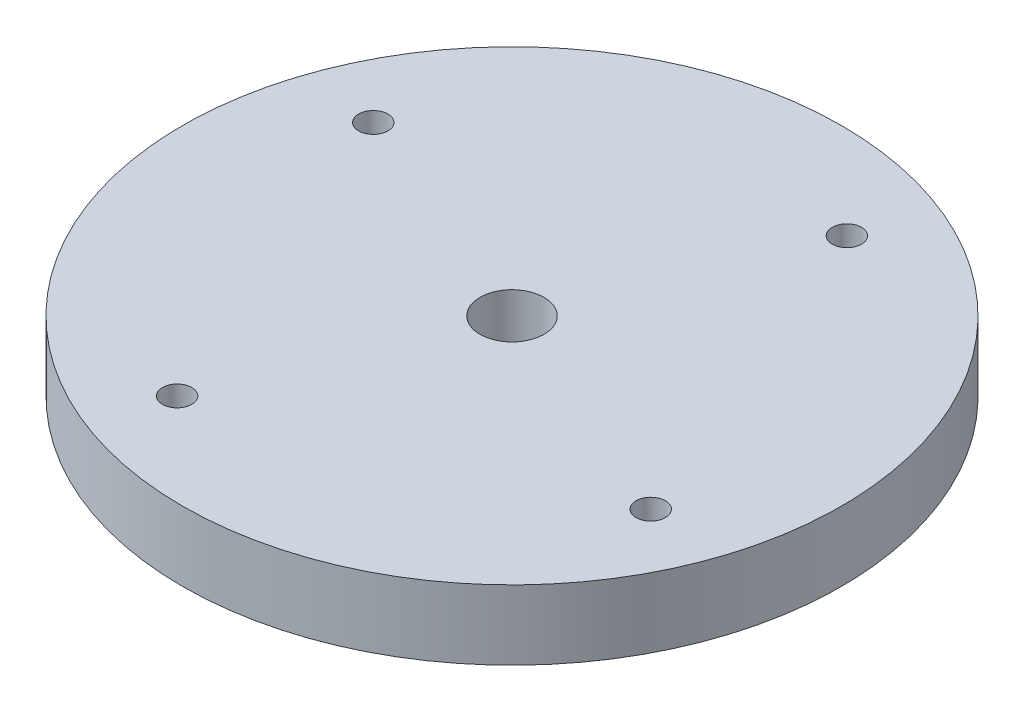
ISO-10303-21;
HEADER;
FILE_DESCRIPTION(('STEP AP214'),'2;1');
FILE_NAME('part.step','',(''),(''),'','','');
FILE_SCHEMA(('AUTOMOTIVE_DESIGN { 1 0 10303 214 1 1 1 1 }'));
ENDSEC;
DATA;
#1=APPLICATION_CONTEXT('core data for automotive mechanical design processes');
#2=APPLICATION_PROTOCOL_DEFINITION('international standard','automotive_design',2000,#1);
#3=PRODUCT_CONTEXT('',#1,'mechanical');
#4=PRODUCT('Part','Part','',(#3));
#5=PRODUCT_RELATED_PRODUCT_CATEGORY('part','',(#4));
#6=PRODUCT_DEFINITION_FORMATION('','',#4);
#7=PRODUCT_DEFINITION_CONTEXT('part definition',#1,'design');
#8=PRODUCT_DEFINITION('design','',#6,#7);
#9=PRODUCT_DEFINITION_SHAPE('','',#8);
#10=(LENGTH_UNIT() NAMED_UNIT(*) SI_UNIT(.MILLI.,.METRE.));
#11=(NAMED_UNIT(*) PLANE_ANGLE_UNIT() SI_UNIT($,.RADIAN.));
#12=(NAMED_UNIT(*) SI_UNIT($,.STERADIAN.) SOLID_ANGLE_UNIT());
#13=UNCERTAINTY_MEASURE_WITH_UNIT(LENGTH_MEASURE(1.E-05),#10,'distance_accuracy_value','');
#14=(GEOMETRIC_REPRESENTATION_CONTEXT(3) GLOBAL_UNCERTAINTY_ASSIGNED_CONTEXT((#13)) GLOBAL_UNIT_ASSIGNED_CONTEXT((#10,
#11,#12)) REPRESENTATION_CONTEXT('',''));
#15=CARTESIAN_POINT('',(0.,0.,0.));
#16=DIRECTION('',(0.,0.,1.));
#17=DIRECTION('',(1.,0.,0.));
#18=AXIS2_PLACEMENT_3D('',#15,#16,#17);
#19=CARTESIAN_POINT('',(0.,-9.5,0.));
#20=DIRECTION('',(0.,1.,0.));
#21=DIRECTION('',(0.,0.,1.));
#22=AXIS2_PLACEMENT_3D('',#19,#20,#21);
#23=CYLINDRICAL_SURFACE('',#22,90.);
#24=CARTESIAN_POINT('',(0.,-9.5,0.));
#25=DIRECTION('',(0.,1.,0.));
#26=DIRECTION('',(0.,0.,1.));
#27=AXIS2_PLACEMENT_3D('',#24,#25,#26);
#28=CIRCLE('',#27,90.);
#29=CARTESIAN_POINT('',(0.,-9.5,90.));
#30=VERTEX_POINT('',#29);
#31=EDGE_CURVE('E10',#30,#30,#28,.T.);
#32=ORIENTED_EDGE('',*,*,#31,.T.);
#33=EDGE_LOOP('',(#32));
#34=FACE_BOUND('',#33,.T.);
#35=CARTESIAN_POINT('',(0.,9.5,0.));
#36=DIRECTION('',(0.,1.,0.));
#37=DIRECTION('',(0.,0.,1.));
#38=AXIS2_PLACEMENT_3D('',#35,#36,#37);
#39=CIRCLE('',#38,90.);
#40=CARTESIAN_POINT('',(0.,9.5,90.));
#41=VERTEX_POINT('',#40);
#42=EDGE_CURVE('E37',#41,#41,#39,.T.);
#43=ORIENTED_EDGE('',*,*,#42,.F.);
#44=EDGE_LOOP('',(#43));
#45=FACE_BOUND('',#44,.T.);
#46=ADVANCED_FACE('F31',(#34,#45),#23,.T.);
#47=CARTESIAN_POINT('',(0.,-9.5,0.));
#48=DIRECTION('',(0.,1.,0.));
#49=DIRECTION('',(0.,0.,1.));
#50=AXIS2_PLACEMENT_3D('',#47,#48,#49);
#51=PLANE('',#50);
#52=CARTESIAN_POINT('',(-26.7878402655561,-9.5,64.6715672757902));
#53=DIRECTION('',(0.,1.,0.));
#54=DIRECTION('',(0.,0.,-1.));
#55=AXIS2_PLACEMENT_3D('',#52,#53,#54);
#56=CIRCLE('',#55,4.);
#57=CARTESIAN_POINT('',(-26.7878402655561,-9.5,60.6715672757902));
#58=VERTEX_POINT('',#57);
#59=EDGE_CURVE('E65',#58,#58,#56,.T.);
#60=ORIENTED_EDGE('',*,*,#59,.T.);
#61=EDGE_LOOP('',(#60));
#62=FACE_BOUND('',#61,.T.);
#63=CARTESIAN_POINT('',(-64.6715672757899,-9.5,-26.7878402655567));
#64=DIRECTION('',(0.,1.,0.));
#65=DIRECTION('',(1.,0.,0.));
#66=AXIS2_PLACEMENT_3D('',#63,#64,#65);
#67=CIRCLE('',#66,4.);
#68=CARTESIAN_POINT('',(-60.6715672757899,-9.5,-26.7878402655567));
#69=VERTEX_POINT('',#68);
#70=EDGE_CURVE('E66',#69,#69,#67,.T.);
#71=ORIENTED_EDGE('',*,*,#70,.T.);
#72=EDGE_LOOP('',(#71));
#73=FACE_BOUND('',#72,.T.);
#74=CARTESIAN_POINT('',(64.6715672757901,-9.5,26.7878402655563));
#75=DIRECTION('',(0.,1.,0.));
#76=DIRECTION('',(-1.,0.,0.));
#77=AXIS2_PLACEMENT_3D('',#74,#75,#76);
#78=CIRCLE('',#77,4.);
#79=CARTESIAN_POINT('',(60.6715672757901,-9.5,26.7878402655563));
#80=VERTEX_POINT('',#79);
#81=EDGE_CURVE('E59',#80,#80,#78,.T.);
#82=ORIENTED_EDGE('',*,*,#81,.T.);
#83=EDGE_LOOP('',(#82));
#84=FACE_BOUND('',#83,.T.);
#85=CARTESIAN_POINT('',(26.7878402655561,-9.5,-64.6715672757902));
#86=DIRECTION('',(0.,1.,0.));
#87=DIRECTION('',(0.,0.,1.));
#88=AXIS2_PLACEMENT_3D('',#85,#86,#87);
#89=CIRCLE('',#88,4.);
#90=CARTESIAN_POINT('',(26.7878402655561,-9.5,-60.6715672757902));
#91=VERTEX_POINT('',#90);
#92=EDGE_CURVE('E53',#91,#91,#89,.T.);
#93=ORIENTED_EDGE('',*,*,#92,.T.);
#94=EDGE_LOOP('',(#93));
#95=FACE_BOUND('',#94,.T.);
#96=CARTESIAN_POINT('',(0.,-9.5,0.));
#97=DIRECTION('',(0.,-1.,0.));
#98=DIRECTION('',(0.,0.,-1.));
#99=AXIS2_PLACEMENT_3D('',#96,#97,#98);
#100=CIRCLE('',#99,8.96);
#101=CARTESIAN_POINT('',(0.,-9.5,-8.96));
#102=VERTEX_POINT('',#101);
#103=EDGE_CURVE('E50',#102,#102,#100,.T.);
#104=ORIENTED_EDGE('',*,*,#103,.F.);
#105=EDGE_LOOP('',(#104));
#106=FACE_BOUND('',#105,.T.);
#107=ORIENTED_EDGE('',*,*,#31,.F.);
#108=EDGE_LOOP('',(#107));
#109=FACE_BOUND('',#108,.T.);
#110=ADVANCED_FACE('F84',(#62,#73,#84,#95,#106,#109),#51,.F.);
#111=CARTESIAN_POINT('',(0.,9.5,0.));
#112=DIRECTION('',(0.,1.,0.));
#113=DIRECTION('',(0.,0.,1.));
#114=AXIS2_PLACEMENT_3D('',#111,#112,#113);
#115=PLANE('',#114);
#116=CARTESIAN_POINT('',(-26.7878402655561,9.5,64.6715672757902));
#117=DIRECTION('',(0.,1.,0.));
#118=DIRECTION('',(0.,0.,-1.));
#119=AXIS2_PLACEMENT_3D('',#116,#117,#118);
#120=CIRCLE('',#119,4.);
#121=CARTESIAN_POINT('',(-26.7878402655561,9.5,60.6715672757902));
#122=VERTEX_POINT('',#121);
#123=EDGE_CURVE('E69',#122,#122,#120,.T.);
#124=ORIENTED_EDGE('',*,*,#123,.F.);
#125=EDGE_LOOP('',(#124));
#126=FACE_BOUND('',#125,.T.);
#127=CARTESIAN_POINT('',(-64.6715672757899,9.5,-26.7878402655567));
#128=DIRECTION('',(0.,1.,0.));
#129=DIRECTION('',(1.,0.,0.));
#130=AXIS2_PLACEMENT_3D('',#127,#128,#129);
#131=CIRCLE('',#130,4.);
#132=CARTESIAN_POINT('',(-60.6715672757899,9.5,-26.7878402655567));
#133=VERTEX_POINT('',#132);
#134=EDGE_CURVE('E70',#133,#133,#131,.T.);
#135=ORIENTED_EDGE('',*,*,#134,.F.);
#136=EDGE_LOOP('',(#135));
#137=FACE_BOUND('',#136,.T.);
#138=CARTESIAN_POINT('',(64.6715672757901,9.5,26.7878402655563));
#139=DIRECTION('',(0.,1.,0.));
#140=DIRECTION('',(-1.,0.,0.));
#141=AXIS2_PLACEMENT_3D('',#138,#139,#140);
#142=CIRCLE('',#141,4.);
#143=CARTESIAN_POINT('',(60.6715672757901,9.5,26.7878402655563));
#144=VERTEX_POINT('',#143);
#145=EDGE_CURVE('E62',#144,#144,#142,.T.);
#146=ORIENTED_EDGE('',*,*,#145,.F.);
#147=EDGE_LOOP('',(#146));
#148=FACE_BOUND('',#147,.T.);
#149=CARTESIAN_POINT('',(26.7878402655561,9.5,-64.6715672757902));
#150=DIRECTION('',(0.,1.,0.));
#151=DIRECTION('',(0.,0.,1.));
#152=AXIS2_PLACEMENT_3D('',#149,#150,#151);
#153=CIRCLE('',#152,4.);
#154=CARTESIAN_POINT('',(26.7878402655561,9.5,-60.6715672757902));
#155=VERTEX_POINT('',#154);
#156=EDGE_CURVE('E56',#155,#155,#153,.T.);
#157=ORIENTED_EDGE('',*,*,#156,.F.);
#158=EDGE_LOOP('',(#157));
#159=FACE_BOUND('',#158,.T.);
#160=CARTESIAN_POINT('',(0.,9.5,0.));
#161=DIRECTION('',(0.,-1.,0.));
#162=DIRECTION('',(0.,0.,-1.));
#163=AXIS2_PLACEMENT_3D('',#160,#161,#162);
#164=CIRCLE('',#163,8.75);
#165=CARTESIAN_POINT('',(0.,9.5,-8.75));
#166=VERTEX_POINT('',#165);
#167=EDGE_CURVE('E41',#166,#166,#164,.T.);
#168=ORIENTED_EDGE('',*,*,#167,.T.);
#169=EDGE_LOOP('',(#168));
#170=FACE_BOUND('',#169,.T.);
#171=ORIENTED_EDGE('',*,*,#42,.T.);
#172=EDGE_LOOP('',(#171));
#173=FACE_BOUND('',#172,.T.);
#174=ADVANCED_FACE('F80',(#126,#137,#148,#159,#170,#173),#115,.T.);
#175=CARTESIAN_POINT('',(0.,-9.5,0.));
#176=DIRECTION('',(0.,-1.,0.));
#177=DIRECTION('',(0.,0.,-1.));
#178=AXIS2_PLACEMENT_3D('',#175,#176,#177);
#179=CYLINDRICAL_SURFACE('',#178,8.75);
#180=ORIENTED_EDGE('',*,*,#167,.F.);
#181=EDGE_LOOP('',(#180));
#182=FACE_BOUND('',#181,.T.);
#183=CARTESIAN_POINT('',(0.,-9.29,0.));
#184=DIRECTION('',(0.,-1.,0.));
#185=DIRECTION('',(0.,0.,-1.));
#186=AXIS2_PLACEMENT_3D('',#183,#184,#185);
#187=CIRCLE('',#186,8.75);
#188=CARTESIAN_POINT('',(0.,-9.29,-8.75));
#189=VERTEX_POINT('',#188);
#190=EDGE_CURVE('E45',#189,#189,#187,.T.);
#191=ORIENTED_EDGE('',*,*,#190,.T.);
#192=EDGE_LOOP('',(#191));
#193=FACE_BOUND('',#192,.T.);
#194=ADVANCED_FACE('F83',(#182,#193),#179,.F.);
#195=CARTESIAN_POINT('',(0.,-9.5,0.));
#196=DIRECTION('',(0.,-1.,0.));
#197=DIRECTION('',(0.,0.,-1.));
#198=AXIS2_PLACEMENT_3D('',#195,#196,#197);
#199=CONICAL_SURFACE('',#198,8.96,0.785398163397448);
#200=ORIENTED_EDGE('',*,*,#190,.F.);
#201=EDGE_LOOP('',(#200));
#202=FACE_BOUND('',#201,.T.);
#203=ORIENTED_EDGE('',*,*,#103,.T.);
#204=EDGE_LOOP('',(#203));
#205=FACE_BOUND('',#204,.T.);
#206=ADVANCED_FACE('F96',(#202,#205),#199,.F.);
#207=CARTESIAN_POINT('',(26.7878402655561,-9.5,-64.6715672757902));
#208=DIRECTION('',(0.,1.,0.));
#209=DIRECTION('',(0.,0.,1.));
#210=AXIS2_PLACEMENT_3D('',#207,#208,#209);
#211=CYLINDRICAL_SURFACE('',#210,4.);
#212=ORIENTED_EDGE('',*,*,#92,.F.);
#213=EDGE_LOOP('',(#212));
#214=FACE_BOUND('',#213,.T.);
#215=ORIENTED_EDGE('',*,*,#156,.T.);
#216=EDGE_LOOP('',(#215));
#217=FACE_BOUND('',#216,.T.);
#218=ADVANCED_FACE('F102',(#214,#217),#211,.F.);
#219=CARTESIAN_POINT('',(64.6715672757901,-9.5,26.7878402655563));
#220=DIRECTION('',(0.,1.,0.));
#221=DIRECTION('',(0.,0.,1.));
#222=AXIS2_PLACEMENT_3D('',#219,#220,#221);
#223=CYLINDRICAL_SURFACE('',#222,4.);
#224=ORIENTED_EDGE('',*,*,#81,.F.);
#225=EDGE_LOOP('',(#224));
#226=FACE_BOUND('',#225,.T.);
#227=ORIENTED_EDGE('',*,*,#145,.T.);
#228=EDGE_LOOP('',(#227));
#229=FACE_BOUND('',#228,.T.);
#230=ADVANCED_FACE('F116',(#226,#229),#223,.F.);
#231=CARTESIAN_POINT('',(-64.6715672757899,-9.5,-26.7878402655567));
#232=DIRECTION('',(0.,1.,0.));
#233=DIRECTION('',(0.,0.,1.));
#234=AXIS2_PLACEMENT_3D('',#231,#232,#233);
#235=CYLINDRICAL_SURFACE('',#234,4.);
#236=ORIENTED_EDGE('',*,*,#70,.F.);
#237=EDGE_LOOP('',(#236));
#238=FACE_BOUND('',#237,.T.);
#239=ORIENTED_EDGE('',*,*,#134,.T.);
#240=EDGE_LOOP('',(#239));
#241=FACE_BOUND('',#240,.T.);
#242=ADVANCED_FACE('F120',(#238,#241),#235,.F.);
#243=CARTESIAN_POINT('',(-26.7878402655561,-9.5,64.6715672757902));
#244=DIRECTION('',(0.,1.,0.));
#245=DIRECTION('',(0.,0.,1.));
#246=AXIS2_PLACEMENT_3D('',#243,#244,#245);
#247=CYLINDRICAL_SURFACE('',#246,4.);
#248=ORIENTED_EDGE('',*,*,#59,.F.);
#249=EDGE_LOOP('',(#248));
#250=FACE_BOUND('',#249,.T.);
#251=ORIENTED_EDGE('',*,*,#123,.T.);
#252=EDGE_LOOP('',(#251));
#253=FACE_BOUND('',#252,.T.);
#254=ADVANCED_FACE('F78',(#250,#253),#247,.F.);
#255=CLOSED_SHELL('',(#46,#110,#174,#194,#206,#218,#230,#242,#254));
#256=MANIFOLD_SOLID_BREP('B2',#255);
#257=ADVANCED_BREP_SHAPE_REPRESENTATION('',(#18,#256),#14);
#258=SHAPE_DEFINITION_REPRESENTATION(#9,#257);
ENDSEC;
END-ISO-10303-21;
